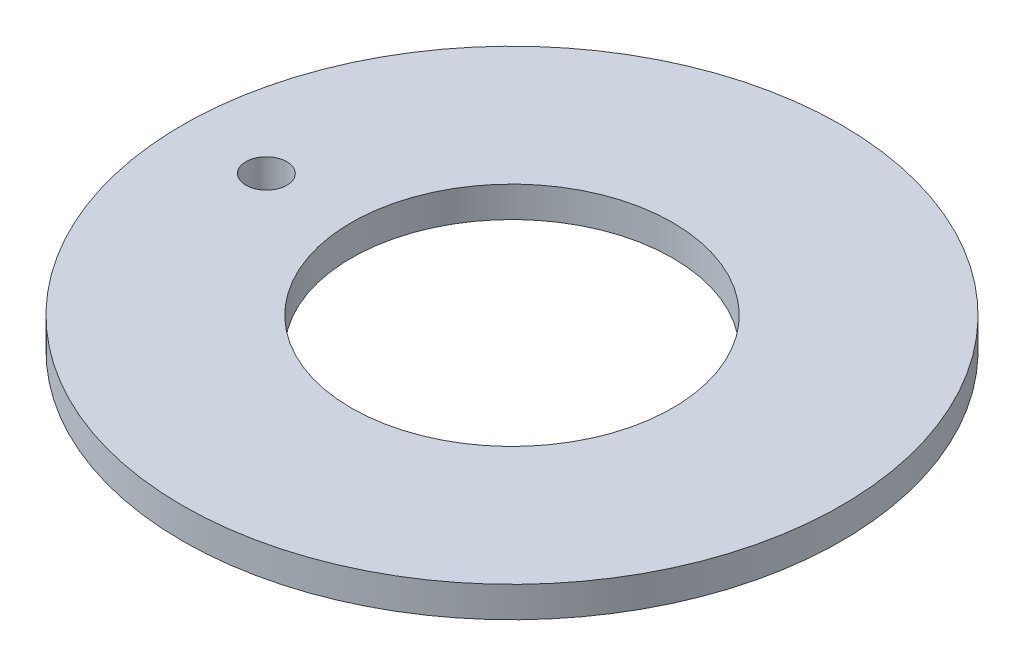
ISO-10303-21;
HEADER;
FILE_DESCRIPTION(('STEP AP214'),'2;1');
FILE_NAME('part.step','',(''),(''),'','','');
FILE_SCHEMA(('AUTOMOTIVE_DESIGN { 1 0 10303 214 1 1 1 1 }'));
ENDSEC;
DATA;
#1=APPLICATION_CONTEXT('core data for automotive mechanical design processes');
#2=APPLICATION_PROTOCOL_DEFINITION('international standard','automotive_design',2000,#1);
#3=PRODUCT_CONTEXT('',#1,'mechanical');
#4=PRODUCT('Part','Part','',(#3));
#5=PRODUCT_RELATED_PRODUCT_CATEGORY('part','',(#4));
#6=PRODUCT_DEFINITION_FORMATION('','',#4);
#7=PRODUCT_DEFINITION_CONTEXT('part definition',#1,'design');
#8=PRODUCT_DEFINITION('design','',#6,#7);
#9=PRODUCT_DEFINITION_SHAPE('','',#8);
#10=(LENGTH_UNIT() NAMED_UNIT(*) SI_UNIT(.MILLI.,.METRE.));
#11=(NAMED_UNIT(*) PLANE_ANGLE_UNIT() SI_UNIT($,.RADIAN.));
#12=(NAMED_UNIT(*) SI_UNIT($,.STERADIAN.) SOLID_ANGLE_UNIT());
#13=UNCERTAINTY_MEASURE_WITH_UNIT(LENGTH_MEASURE(1.E-05),#10,'distance_accuracy_value','');
#14=(GEOMETRIC_REPRESENTATION_CONTEXT(3) GLOBAL_UNCERTAINTY_ASSIGNED_CONTEXT((#13)) GLOBAL_UNIT_ASSIGNED_CONTEXT((#10,
#11,#12)) REPRESENTATION_CONTEXT('',''));
#15=CARTESIAN_POINT('',(0.,0.,0.));
#16=DIRECTION('',(0.,0.,1.));
#17=DIRECTION('',(1.,0.,0.));
#18=AXIS2_PLACEMENT_3D('',#15,#16,#17);
#19=CARTESIAN_POINT('',(0.,3.,0.));
#20=DIRECTION('',(0.,1.,0.));
#21=DIRECTION('',(0.,0.,1.));
#22=AXIS2_PLACEMENT_3D('',#19,#20,#21);
#23=PLANE('',#22);
#24=CARTESIAN_POINT('',(-24.,3.,0.));
#25=DIRECTION('',(0.,1.,0.));
#26=DIRECTION('',(0.,0.,1.));
#27=AXIS2_PLACEMENT_3D('',#24,#25,#26);
#28=CIRCLE('',#27,2.);
#29=CARTESIAN_POINT('',(-24.,3.,2.));
#30=VERTEX_POINT('',#29);
#31=EDGE_CURVE('E50',#30,#30,#28,.T.);
#32=ORIENTED_EDGE('',*,*,#31,.F.);
#33=EDGE_LOOP('',(#32));
#34=FACE_BOUND('',#33,.T.);
#35=CARTESIAN_POINT('',(0.,3.,0.));
#36=DIRECTION('',(0.,1.,0.));
#37=DIRECTION('',(0.,0.,1.));
#38=AXIS2_PLACEMENT_3D('',#35,#36,#37);
#39=CIRCLE('',#38,32.2);
#40=CARTESIAN_POINT('',(0.,3.,32.2));
#41=VERTEX_POINT('',#40);
#42=EDGE_CURVE('E10',#41,#41,#39,.T.);
#43=ORIENTED_EDGE('',*,*,#42,.T.);
#44=EDGE_LOOP('',(#43));
#45=FACE_BOUND('',#44,.T.);
#46=CARTESIAN_POINT('',(0.,3.,0.));
#47=DIRECTION('',(0.,1.,0.));
#48=DIRECTION('',(0.,0.,1.));
#49=AXIS2_PLACEMENT_3D('',#46,#47,#48);
#50=CIRCLE('',#49,15.7);
#51=CARTESIAN_POINT('',(0.,3.,15.7));
#52=VERTEX_POINT('',#51);
#53=EDGE_CURVE('E42',#52,#52,#50,.T.);
#54=ORIENTED_EDGE('',*,*,#53,.F.);
#55=EDGE_LOOP('',(#54));
#56=FACE_BOUND('',#55,.T.);
#57=ADVANCED_FACE('F31',(#34,#45,#56),#23,.T.);
#58=CARTESIAN_POINT('',(0.,0.,0.));
#59=DIRECTION('',(0.,1.,0.));
#60=DIRECTION('',(0.,0.,1.));
#61=AXIS2_PLACEMENT_3D('',#58,#59,#60);
#62=PLANE('',#61);
#63=CARTESIAN_POINT('',(-24.,0.,0.));
#64=DIRECTION('',(0.,1.,0.));
#65=DIRECTION('',(0.,0.,1.));
#66=AXIS2_PLACEMENT_3D('',#63,#64,#65);
#67=CIRCLE('',#66,2.);
#68=CARTESIAN_POINT('',(-24.,0.,2.));
#69=VERTEX_POINT('',#68);
#70=EDGE_CURVE('E47',#69,#69,#67,.T.);
#71=ORIENTED_EDGE('',*,*,#70,.T.);
#72=EDGE_LOOP('',(#71));
#73=FACE_BOUND('',#72,.T.);
#74=CARTESIAN_POINT('',(0.,0.,0.));
#75=DIRECTION('',(0.,1.,0.));
#76=DIRECTION('',(0.,0.,1.));
#77=AXIS2_PLACEMENT_3D('',#74,#75,#76);
#78=CIRCLE('',#77,32.2);
#79=CARTESIAN_POINT('',(0.,0.,32.2));
#80=VERTEX_POINT('',#79);
#81=EDGE_CURVE('E35',#80,#80,#78,.T.);
#82=ORIENTED_EDGE('',*,*,#81,.F.);
#83=EDGE_LOOP('',(#82));
#84=FACE_BOUND('',#83,.T.);
#85=CARTESIAN_POINT('',(0.,0.,0.));
#86=DIRECTION('',(0.,1.,0.));
#87=DIRECTION('',(0.,0.,1.));
#88=AXIS2_PLACEMENT_3D('',#85,#86,#87);
#89=CIRCLE('',#88,15.7);
#90=CARTESIAN_POINT('',(0.,0.,15.7));
#91=VERTEX_POINT('',#90);
#92=EDGE_CURVE('E44',#91,#91,#89,.T.);
#93=ORIENTED_EDGE('',*,*,#92,.T.);
#94=EDGE_LOOP('',(#93));
#95=FACE_BOUND('',#94,.T.);
#96=ADVANCED_FACE('F56',(#73,#84,#95),#62,.F.);
#97=CARTESIAN_POINT('',(0.,3.,0.));
#98=DIRECTION('',(0.,-1.,0.));
#99=DIRECTION('',(0.,0.,-1.));
#100=AXIS2_PLACEMENT_3D('',#97,#98,#99);
#101=CYLINDRICAL_SURFACE('',#100,32.2);
#102=ORIENTED_EDGE('',*,*,#42,.F.);
#103=EDGE_LOOP('',(#102));
#104=FACE_BOUND('',#103,.T.);
#105=ORIENTED_EDGE('',*,*,#81,.T.);
#106=EDGE_LOOP('',(#105));
#107=FACE_BOUND('',#106,.T.);
#108=ADVANCED_FACE('F33',(#104,#107),#101,.T.);
#109=CARTESIAN_POINT('',(0.,3.,0.));
#110=DIRECTION('',(0.,-1.,0.));
#111=DIRECTION('',(0.,0.,-1.));
#112=AXIS2_PLACEMENT_3D('',#109,#110,#111);
#113=CYLINDRICAL_SURFACE('',#112,15.7);
#114=ORIENTED_EDGE('',*,*,#53,.T.);
#115=EDGE_LOOP('',(#114));
#116=FACE_BOUND('',#115,.T.);
#117=ORIENTED_EDGE('',*,*,#92,.F.);
#118=EDGE_LOOP('',(#117));
#119=FACE_BOUND('',#118,.T.);
#120=ADVANCED_FACE('F62',(#116,#119),#113,.F.);
#121=CARTESIAN_POINT('',(-24.,0.,0.));
#122=DIRECTION('',(0.,1.,0.));
#123=DIRECTION('',(0.,0.,1.));
#124=AXIS2_PLACEMENT_3D('',#121,#122,#123);
#125=CYLINDRICAL_SURFACE('',#124,2.);
#126=ORIENTED_EDGE('',*,*,#70,.F.);
#127=EDGE_LOOP('',(#126));
#128=FACE_BOUND('',#127,.T.);
#129=ORIENTED_EDGE('',*,*,#31,.T.);
#130=EDGE_LOOP('',(#129));
#131=FACE_BOUND('',#130,.T.);
#132=ADVANCED_FACE('F59',(#128,#131),#125,.F.);
#133=CLOSED_SHELL('',(#57,#96,#108,#120,#132));
#134=MANIFOLD_SOLID_BREP('B2',#133);
#135=ADVANCED_BREP_SHAPE_REPRESENTATION('',(#18,#134),#14);
#136=SHAPE_DEFINITION_REPRESENTATION(#9,#135);
ENDSEC;
END-ISO-10303-21;
